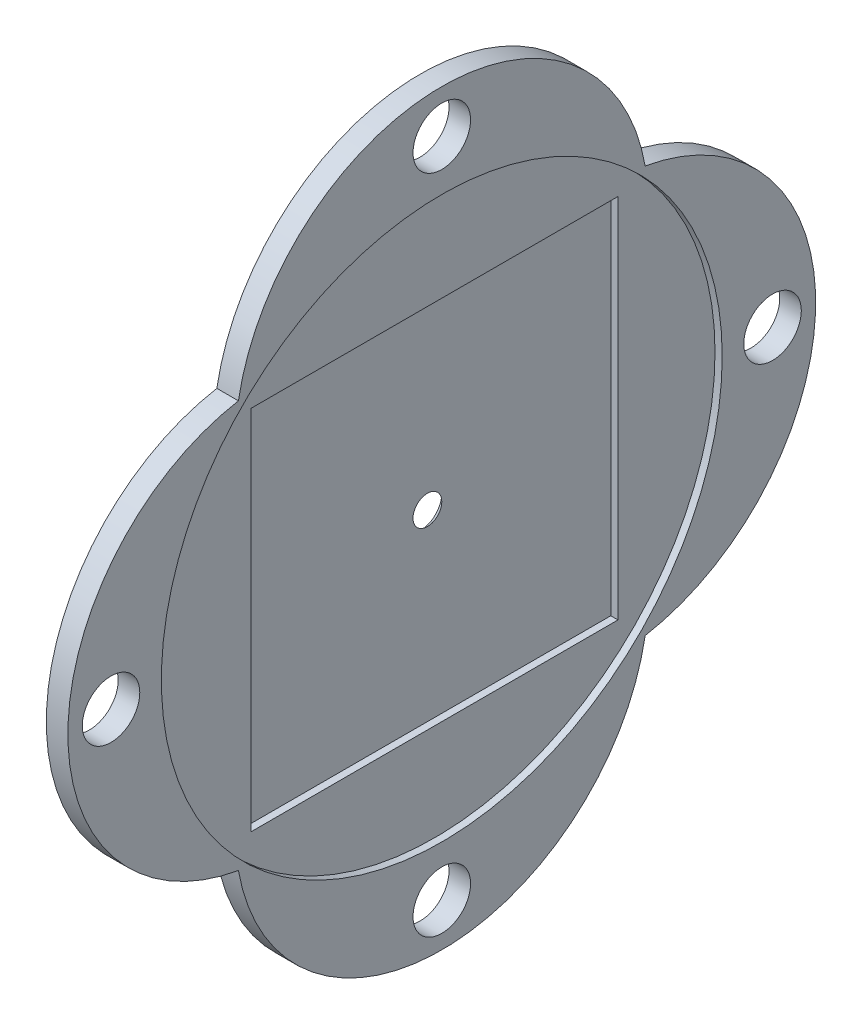
ISO-10303-21;
HEADER;
FILE_DESCRIPTION(('STEP AP214'),'2;1');
FILE_NAME('part.step','',(''),(''),'','','');
FILE_SCHEMA(('AUTOMOTIVE_DESIGN { 1 0 10303 214 1 1 1 1 }'));
ENDSEC;
DATA;
#1=APPLICATION_CONTEXT('core data for automotive mechanical design processes');
#2=APPLICATION_PROTOCOL_DEFINITION('international standard','automotive_design',2000,#1);
#3=PRODUCT_CONTEXT('',#1,'mechanical');
#4=PRODUCT('Part','Part','',(#3));
#5=PRODUCT_RELATED_PRODUCT_CATEGORY('part','',(#4));
#6=PRODUCT_DEFINITION_FORMATION('','',#4);
#7=PRODUCT_DEFINITION_CONTEXT('part definition',#1,'design');
#8=PRODUCT_DEFINITION('design','',#6,#7);
#9=PRODUCT_DEFINITION_SHAPE('','',#8);
#10=(LENGTH_UNIT() NAMED_UNIT(*) SI_UNIT(.MILLI.,.METRE.));
#11=(NAMED_UNIT(*) PLANE_ANGLE_UNIT() SI_UNIT($,.RADIAN.));
#12=(NAMED_UNIT(*) SI_UNIT($,.STERADIAN.) SOLID_ANGLE_UNIT());
#13=UNCERTAINTY_MEASURE_WITH_UNIT(LENGTH_MEASURE(1.E-05),#10,'distance_accuracy_value','');
#14=(GEOMETRIC_REPRESENTATION_CONTEXT(3) GLOBAL_UNCERTAINTY_ASSIGNED_CONTEXT((#13)) GLOBAL_UNIT_ASSIGNED_CONTEXT((#10,
#11,#12)) REPRESENTATION_CONTEXT('',''));
#15=CARTESIAN_POINT('',(0.,0.,0.));
#16=DIRECTION('',(0.,0.,1.));
#17=DIRECTION('',(1.,0.,0.));
#18=AXIS2_PLACEMENT_3D('',#15,#16,#17);
#19=CARTESIAN_POINT('',(0.75,-5.81892302108712,-5.81892302108705));
#20=DIRECTION('',(1.,0.,0.));
#21=DIRECTION('',(0.,0.,-1.));
#22=AXIS2_PLACEMENT_3D('',#19,#20,#21);
#23=PLANE('',#22);
#24=CARTESIAN_POINT('',(0.75,0.,0.));
#25=DIRECTION('',(1.,0.,0.));
#26=DIRECTION('',(0.,0.,-1.));
#27=AXIS2_PLACEMENT_3D('',#24,#25,#26);
#28=CIRCLE('',#27,19.5);
#29=CARTESIAN_POINT('',(0.75,0.,-19.5));
#30=VERTEX_POINT('',#29);
#31=EDGE_CURVE('E152',#30,#30,#28,.T.);
#32=ORIENTED_EDGE('',*,*,#31,.F.);
#33=EDGE_LOOP('',(#32));
#34=FACE_BOUND('',#33,.T.);
#35=CARTESIAN_POINT('',(0.75,-23.,0.));
#36=DIRECTION('',(1.,0.,0.));
#37=DIRECTION('',(0.,0.,-1.));
#38=AXIS2_PLACEMENT_3D('',#35,#36,#37);
#39=CIRCLE('',#38,2.);
#40=CARTESIAN_POINT('',(0.75,-23.,-2.));
#41=VERTEX_POINT('',#40);
#42=EDGE_CURVE('E168',#41,#41,#39,.T.);
#43=ORIENTED_EDGE('',*,*,#42,.F.);
#44=EDGE_LOOP('',(#43));
#45=FACE_BOUND('',#44,.T.);
#46=CARTESIAN_POINT('',(0.75,23.,0.));
#47=DIRECTION('',(1.,0.,0.));
#48=DIRECTION('',(0.,0.,-1.));
#49=AXIS2_PLACEMENT_3D('',#46,#47,#48);
#50=CIRCLE('',#49,2.);
#51=CARTESIAN_POINT('',(0.75,23.,-2.));
#52=VERTEX_POINT('',#51);
#53=EDGE_CURVE('E180',#52,#52,#50,.T.);
#54=ORIENTED_EDGE('',*,*,#53,.F.);
#55=EDGE_LOOP('',(#54));
#56=FACE_BOUND('',#55,.T.);
#57=CARTESIAN_POINT('',(0.75,-11.6378460421741,0.));
#58=DIRECTION('',(1.,0.,0.));
#59=DIRECTION('',(0.,0.,-1.));
#60=AXIS2_PLACEMENT_3D('',#57,#58,#59);
#61=CIRCLE('',#60,14.3621539578259);
#62=CARTESIAN_POINT('',(0.75,-14.1421356237309,14.142135623731));
#63=VERTEX_POINT('',#62);
#64=CARTESIAN_POINT('',(0.75,-14.142135623731,-14.142135623731));
#65=VERTEX_POINT('',#64);
#66=EDGE_CURVE('E186',#63,#65,#61,.T.);
#67=ORIENTED_EDGE('',*,*,#66,.T.);
#68=CARTESIAN_POINT('',(0.75,-1.21899966841741E-13,-11.6378460421741));
#69=DIRECTION('',(1.,0.,0.));
#70=DIRECTION('',(0.,0.,-1.));
#71=AXIS2_PLACEMENT_3D('',#68,#69,#70);
#72=CIRCLE('',#71,14.3621539578259);
#73=CARTESIAN_POINT('',(0.75,14.1421356237309,-14.1421356237311));
#74=VERTEX_POINT('',#73);
#75=EDGE_CURVE('E93',#65,#74,#72,.T.);
#76=ORIENTED_EDGE('',*,*,#75,.T.);
#77=CARTESIAN_POINT('',(0.75,11.6378460421741,0.));
#78=DIRECTION('',(1.,0.,0.));
#79=DIRECTION('',(0.,0.,-1.));
#80=AXIS2_PLACEMENT_3D('',#77,#78,#79);
#81=CIRCLE('',#80,14.3621539578259);
#82=CARTESIAN_POINT('',(0.75,14.142135623731,14.1421356237309));
#83=VERTEX_POINT('',#82);
#84=EDGE_CURVE('E189',#74,#83,#81,.T.);
#85=ORIENTED_EDGE('',*,*,#84,.T.);
#86=CARTESIAN_POINT('',(0.75,0.,11.6378460421741));
#87=DIRECTION('',(1.,0.,0.));
#88=DIRECTION('',(0.,0.,-1.));
#89=AXIS2_PLACEMENT_3D('',#86,#87,#88);
#90=CIRCLE('',#89,14.3621539578259);
#91=EDGE_CURVE('E64',#83,#63,#90,.T.);
#92=ORIENTED_EDGE('',*,*,#91,.T.);
#93=EDGE_LOOP('',(#67,#76,#85,#92));
#94=FACE_BOUND('',#93,.T.);
#95=CARTESIAN_POINT('',(0.75,0.,-23.));
#96=DIRECTION('',(1.,0.,0.));
#97=DIRECTION('',(0.,0.,-1.));
#98=AXIS2_PLACEMENT_3D('',#95,#96,#97);
#99=CIRCLE('',#98,2.);
#100=CARTESIAN_POINT('',(0.75,0.,-25.));
#101=VERTEX_POINT('',#100);
#102=EDGE_CURVE('E174',#101,#101,#99,.T.);
#103=ORIENTED_EDGE('',*,*,#102,.F.);
#104=EDGE_LOOP('',(#103));
#105=FACE_BOUND('',#104,.T.);
#106=CARTESIAN_POINT('',(0.75,0.,23.));
#107=DIRECTION('',(1.,0.,0.));
#108=DIRECTION('',(0.,0.,-1.));
#109=AXIS2_PLACEMENT_3D('',#106,#107,#108);
#110=CIRCLE('',#109,2.);
#111=CARTESIAN_POINT('',(0.75,0.,21.));
#112=VERTEX_POINT('',#111);
#113=EDGE_CURVE('E162',#112,#112,#110,.T.);
#114=ORIENTED_EDGE('',*,*,#113,.F.);
#115=EDGE_LOOP('',(#114));
#116=FACE_BOUND('',#115,.T.);
#117=ADVANCED_FACE('F39',(#34,#45,#56,#94,#105,#116),#23,.T.);
#118=CARTESIAN_POINT('',(-0.75,-5.81892302108712,-5.81892302108705));
#119=DIRECTION('',(1.,0.,0.));
#120=DIRECTION('',(0.,0.,-1.));
#121=AXIS2_PLACEMENT_3D('',#118,#119,#120);
#122=PLANE('',#121);
#123=CARTESIAN_POINT('',(-0.75,0.,0.));
#124=DIRECTION('',(1.,0.,0.));
#125=DIRECTION('',(0.,0.,-1.));
#126=AXIS2_PLACEMENT_3D('',#123,#124,#125);
#127=CIRCLE('',#126,1.50000000000002);
#128=CARTESIAN_POINT('',(-0.75,0.,-1.50000000000002));
#129=VERTEX_POINT('',#128);
#130=EDGE_CURVE('E48',#129,#129,#127,.T.);
#131=ORIENTED_EDGE('',*,*,#130,.T.);
#132=EDGE_LOOP('',(#131));
#133=FACE_BOUND('',#132,.T.);
#134=CARTESIAN_POINT('',(-0.75,-11.6378460421741,0.));
#135=DIRECTION('',(1.,0.,0.));
#136=DIRECTION('',(0.,0.,-1.));
#137=AXIS2_PLACEMENT_3D('',#134,#135,#136);
#138=CIRCLE('',#137,14.3621539578259);
#139=CARTESIAN_POINT('',(-0.75,-14.1421356237309,14.142135623731));
#140=VERTEX_POINT('',#139);
#141=CARTESIAN_POINT('',(-0.75,-14.142135623731,-14.142135623731));
#142=VERTEX_POINT('',#141);
#143=EDGE_CURVE('E183',#140,#142,#138,.T.);
#144=ORIENTED_EDGE('',*,*,#143,.F.);
#145=CARTESIAN_POINT('',(-0.75,0.,11.6378460421741));
#146=DIRECTION('',(1.,0.,0.));
#147=DIRECTION('',(0.,0.,-1.));
#148=AXIS2_PLACEMENT_3D('',#145,#146,#147);
#149=CIRCLE('',#148,14.3621539578259);
#150=CARTESIAN_POINT('',(-0.75,14.142135623731,14.1421356237309));
#151=VERTEX_POINT('',#150);
#152=EDGE_CURVE('E85',#151,#140,#149,.T.);
#153=ORIENTED_EDGE('',*,*,#152,.F.);
#154=CARTESIAN_POINT('',(-0.75,11.6378460421741,0.));
#155=DIRECTION('',(1.,0.,0.));
#156=DIRECTION('',(0.,0.,-1.));
#157=AXIS2_PLACEMENT_3D('',#154,#155,#156);
#158=CIRCLE('',#157,14.3621539578259);
#159=CARTESIAN_POINT('',(-0.75,14.1421356237309,-14.1421356237311));
#160=VERTEX_POINT('',#159);
#161=EDGE_CURVE('E197',#160,#151,#158,.T.);
#162=ORIENTED_EDGE('',*,*,#161,.F.);
#163=CARTESIAN_POINT('',(-0.75,-1.21899966841741E-13,-11.6378460421741));
#164=DIRECTION('',(1.,0.,0.));
#165=DIRECTION('',(0.,0.,-1.));
#166=AXIS2_PLACEMENT_3D('',#163,#164,#165);
#167=CIRCLE('',#166,14.3621539578259);
#168=EDGE_CURVE('E195',#142,#160,#167,.T.);
#169=ORIENTED_EDGE('',*,*,#168,.F.);
#170=EDGE_LOOP('',(#144,#153,#162,#169));
#171=FACE_BOUND('',#170,.T.);
#172=CARTESIAN_POINT('',(-0.75,23.,0.));
#173=DIRECTION('',(1.,0.,0.));
#174=DIRECTION('',(0.,0.,-1.));
#175=AXIS2_PLACEMENT_3D('',#172,#173,#174);
#176=CIRCLE('',#175,2.);
#177=CARTESIAN_POINT('',(-0.75,23.,-2.));
#178=VERTEX_POINT('',#177);
#179=EDGE_CURVE('E177',#178,#178,#176,.T.);
#180=ORIENTED_EDGE('',*,*,#179,.T.);
#181=EDGE_LOOP('',(#180));
#182=FACE_BOUND('',#181,.T.);
#183=CARTESIAN_POINT('',(-0.75,0.,-23.));
#184=DIRECTION('',(1.,0.,0.));
#185=DIRECTION('',(0.,0.,-1.));
#186=AXIS2_PLACEMENT_3D('',#183,#184,#185);
#187=CIRCLE('',#186,2.);
#188=CARTESIAN_POINT('',(-0.75,0.,-25.));
#189=VERTEX_POINT('',#188);
#190=EDGE_CURVE('E171',#189,#189,#187,.T.);
#191=ORIENTED_EDGE('',*,*,#190,.T.);
#192=EDGE_LOOP('',(#191));
#193=FACE_BOUND('',#192,.T.);
#194=CARTESIAN_POINT('',(-0.75,-23.,0.));
#195=DIRECTION('',(1.,0.,0.));
#196=DIRECTION('',(0.,0.,-1.));
#197=AXIS2_PLACEMENT_3D('',#194,#195,#196);
#198=CIRCLE('',#197,2.);
#199=CARTESIAN_POINT('',(-0.75,-23.,-2.));
#200=VERTEX_POINT('',#199);
#201=EDGE_CURVE('E165',#200,#200,#198,.T.);
#202=ORIENTED_EDGE('',*,*,#201,.T.);
#203=EDGE_LOOP('',(#202));
#204=FACE_BOUND('',#203,.T.);
#205=CARTESIAN_POINT('',(-0.75,0.,23.));
#206=DIRECTION('',(1.,0.,0.));
#207=DIRECTION('',(0.,0.,-1.));
#208=AXIS2_PLACEMENT_3D('',#205,#206,#207);
#209=CIRCLE('',#208,2.);
#210=CARTESIAN_POINT('',(-0.75,0.,21.));
#211=VERTEX_POINT('',#210);
#212=EDGE_CURVE('E159',#211,#211,#209,.T.);
#213=ORIENTED_EDGE('',*,*,#212,.T.);
#214=EDGE_LOOP('',(#213));
#215=FACE_BOUND('',#214,.T.);
#216=ADVANCED_FACE('F210',(#133,#171,#182,#193,#204,#215),#122,.F.);
#217=CARTESIAN_POINT('',(0.75,-11.6378460421741,0.));
#218=DIRECTION('',(-1.,0.,0.));
#219=DIRECTION('',(0.,0.,1.));
#220=AXIS2_PLACEMENT_3D('',#217,#218,#219);
#221=CYLINDRICAL_SURFACE('',#220,14.3621539578259);
#222=ORIENTED_EDGE('',*,*,#143,.T.);
#223=DIRECTION('',(-1.,0.,0.));
#224=VECTOR('',#223,1.);
#225=CARTESIAN_POINT('',(0.75,-14.142135623731,-14.142135623731));
#226=LINE('',#225,#224);
#227=EDGE_CURVE('E206',#65,#142,#226,.T.);
#228=ORIENTED_EDGE('',*,*,#227,.F.);
#229=ORIENTED_EDGE('',*,*,#66,.F.);
#230=DIRECTION('',(-1.,0.,0.));
#231=VECTOR('',#230,1.);
#232=CARTESIAN_POINT('',(0.75,-14.1421356237309,14.142135623731));
#233=LINE('',#232,#231);
#234=EDGE_CURVE('E192',#63,#140,#233,.T.);
#235=ORIENTED_EDGE('',*,*,#234,.T.);
#236=EDGE_LOOP('',(#222,#228,#229,#235));
#237=FACE_BOUND('',#236,.T.);
#238=ADVANCED_FACE('F227',(#237),#221,.T.);
#239=CARTESIAN_POINT('',(0.75,-1.21899966841741E-13,-11.6378460421741));
#240=DIRECTION('',(-1.,0.,0.));
#241=DIRECTION('',(0.,0.,1.));
#242=AXIS2_PLACEMENT_3D('',#239,#240,#241);
#243=CYLINDRICAL_SURFACE('',#242,14.3621539578259);
#244=ORIENTED_EDGE('',*,*,#168,.T.);
#245=DIRECTION('',(-1.,0.,0.));
#246=VECTOR('',#245,1.);
#247=CARTESIAN_POINT('',(0.75,14.1421356237309,-14.1421356237311));
#248=LINE('',#247,#246);
#249=EDGE_CURVE('E203',#74,#160,#248,.T.);
#250=ORIENTED_EDGE('',*,*,#249,.F.);
#251=ORIENTED_EDGE('',*,*,#75,.F.);
#252=ORIENTED_EDGE('',*,*,#227,.T.);
#253=EDGE_LOOP('',(#244,#250,#251,#252));
#254=FACE_BOUND('',#253,.T.);
#255=ADVANCED_FACE('F241',(#254),#243,.T.);
#256=CARTESIAN_POINT('',(0.75,11.6378460421741,0.));
#257=DIRECTION('',(-1.,0.,0.));
#258=DIRECTION('',(0.,0.,1.));
#259=AXIS2_PLACEMENT_3D('',#256,#257,#258);
#260=CYLINDRICAL_SURFACE('',#259,14.3621539578259);
#261=ORIENTED_EDGE('',*,*,#161,.T.);
#262=DIRECTION('',(-1.,0.,0.));
#263=VECTOR('',#262,1.);
#264=CARTESIAN_POINT('',(0.75,14.142135623731,14.1421356237309));
#265=LINE('',#264,#263);
#266=EDGE_CURVE('E201',#83,#151,#265,.T.);
#267=ORIENTED_EDGE('',*,*,#266,.F.);
#268=ORIENTED_EDGE('',*,*,#84,.F.);
#269=ORIENTED_EDGE('',*,*,#249,.T.);
#270=EDGE_LOOP('',(#261,#267,#268,#269));
#271=FACE_BOUND('',#270,.T.);
#272=ADVANCED_FACE('F238',(#271),#260,.T.);
#273=CARTESIAN_POINT('',(0.75,0.,11.6378460421741));
#274=DIRECTION('',(-1.,0.,0.));
#275=DIRECTION('',(0.,0.,1.));
#276=AXIS2_PLACEMENT_3D('',#273,#274,#275);
#277=CYLINDRICAL_SURFACE('',#276,14.3621539578259);
#278=ORIENTED_EDGE('',*,*,#152,.T.);
#279=ORIENTED_EDGE('',*,*,#234,.F.);
#280=ORIENTED_EDGE('',*,*,#91,.F.);
#281=ORIENTED_EDGE('',*,*,#266,.T.);
#282=EDGE_LOOP('',(#278,#279,#280,#281));
#283=FACE_BOUND('',#282,.T.);
#284=ADVANCED_FACE('F235',(#283),#277,.T.);
#285=CARTESIAN_POINT('',(0.75,23.,0.));
#286=DIRECTION('',(-1.,0.,0.));
#287=DIRECTION('',(0.,0.,1.));
#288=AXIS2_PLACEMENT_3D('',#285,#286,#287);
#289=CYLINDRICAL_SURFACE('',#288,2.);
#290=ORIENTED_EDGE('',*,*,#53,.T.);
#291=EDGE_LOOP('',(#290));
#292=FACE_BOUND('',#291,.T.);
#293=ORIENTED_EDGE('',*,*,#179,.F.);
#294=EDGE_LOOP('',(#293));
#295=FACE_BOUND('',#294,.T.);
#296=ADVANCED_FACE('F232',(#292,#295),#289,.F.);
#297=CARTESIAN_POINT('',(0.75,0.,-23.));
#298=DIRECTION('',(-1.,0.,0.));
#299=DIRECTION('',(0.,0.,1.));
#300=AXIS2_PLACEMENT_3D('',#297,#298,#299);
#301=CYLINDRICAL_SURFACE('',#300,2.);
#302=ORIENTED_EDGE('',*,*,#102,.T.);
#303=EDGE_LOOP('',(#302));
#304=FACE_BOUND('',#303,.T.);
#305=ORIENTED_EDGE('',*,*,#190,.F.);
#306=EDGE_LOOP('',(#305));
#307=FACE_BOUND('',#306,.T.);
#308=ADVANCED_FACE('F275',(#304,#307),#301,.F.);
#309=CARTESIAN_POINT('',(0.75,-23.,0.));
#310=DIRECTION('',(-1.,0.,0.));
#311=DIRECTION('',(0.,0.,1.));
#312=AXIS2_PLACEMENT_3D('',#309,#310,#311);
#313=CYLINDRICAL_SURFACE('',#312,2.);
#314=ORIENTED_EDGE('',*,*,#42,.T.);
#315=EDGE_LOOP('',(#314));
#316=FACE_BOUND('',#315,.T.);
#317=ORIENTED_EDGE('',*,*,#201,.F.);
#318=EDGE_LOOP('',(#317));
#319=FACE_BOUND('',#318,.T.);
#320=ADVANCED_FACE('F264',(#316,#319),#313,.F.);
#321=CARTESIAN_POINT('',(0.75,0.,23.));
#322=DIRECTION('',(-1.,0.,0.));
#323=DIRECTION('',(0.,0.,1.));
#324=AXIS2_PLACEMENT_3D('',#321,#322,#323);
#325=CYLINDRICAL_SURFACE('',#324,2.);
#326=ORIENTED_EDGE('',*,*,#113,.T.);
#327=EDGE_LOOP('',(#326));
#328=FACE_BOUND('',#327,.T.);
#329=ORIENTED_EDGE('',*,*,#212,.F.);
#330=EDGE_LOOP('',(#329));
#331=FACE_BOUND('',#330,.T.);
#332=ADVANCED_FACE('F260',(#328,#331),#325,.F.);
#333=CARTESIAN_POINT('',(0.25,0.,0.));
#334=DIRECTION('',(1.,0.,0.));
#335=DIRECTION('',(0.,0.,-1.));
#336=AXIS2_PLACEMENT_3D('',#333,#334,#335);
#337=CYLINDRICAL_SURFACE('',#336,19.5);
#338=CARTESIAN_POINT('',(0.25,0.,0.));
#339=DIRECTION('',(1.,0.,0.));
#340=DIRECTION('',(0.,0.,-1.));
#341=AXIS2_PLACEMENT_3D('',#338,#339,#340);
#342=CIRCLE('',#341,19.5);
#343=CARTESIAN_POINT('',(0.25,0.,-19.5));
#344=VERTEX_POINT('',#343);
#345=EDGE_CURVE('E156',#344,#344,#342,.T.);
#346=ORIENTED_EDGE('',*,*,#345,.F.);
#347=EDGE_LOOP('',(#346));
#348=FACE_BOUND('',#347,.T.);
#349=ORIENTED_EDGE('',*,*,#31,.T.);
#350=EDGE_LOOP('',(#349));
#351=FACE_BOUND('',#350,.T.);
#352=ADVANCED_FACE('F263',(#348,#351),#337,.F.);
#353=CARTESIAN_POINT('',(0.25,0.,0.));
#354=DIRECTION('',(1.,0.,0.));
#355=DIRECTION('',(0.,0.,-1.));
#356=AXIS2_PLACEMENT_3D('',#353,#354,#355);
#357=PLANE('',#356);
#358=DIRECTION('',(0.,-1.,0.));
#359=VECTOR('',#358,1.);
#360=CARTESIAN_POINT('',(0.25,12.75,12.75));
#361=LINE('',#360,#359);
#362=CARTESIAN_POINT('',(0.25,12.75,12.75));
#363=VERTEX_POINT('',#362);
#364=CARTESIAN_POINT('',(0.25,-12.75,12.75));
#365=VERTEX_POINT('',#364);
#366=EDGE_CURVE('E122',#363,#365,#361,.T.);
#367=ORIENTED_EDGE('',*,*,#366,.F.);
#368=DIRECTION('',(0.,0.,1.));
#369=VECTOR('',#368,1.);
#370=CARTESIAN_POINT('',(0.25,12.75,12.75));
#371=LINE('',#370,#369);
#372=CARTESIAN_POINT('',(0.25,12.75,-12.75));
#373=VERTEX_POINT('',#372);
#374=EDGE_CURVE('E139',#373,#363,#371,.T.);
#375=ORIENTED_EDGE('',*,*,#374,.F.);
#376=DIRECTION('',(0.,1.,0.));
#377=VECTOR('',#376,1.);
#378=CARTESIAN_POINT('',(0.25,12.75,-12.75));
#379=LINE('',#378,#377);
#380=CARTESIAN_POINT('',(0.25,-12.75,-12.75));
#381=VERTEX_POINT('',#380);
#382=EDGE_CURVE('E55',#381,#373,#379,.T.);
#383=ORIENTED_EDGE('',*,*,#382,.F.);
#384=DIRECTION('',(0.,0.,-1.));
#385=VECTOR('',#384,1.);
#386=CARTESIAN_POINT('',(0.25,-12.75,12.75));
#387=LINE('',#386,#385);
#388=EDGE_CURVE('E147',#365,#381,#387,.T.);
#389=ORIENTED_EDGE('',*,*,#388,.F.);
#390=EDGE_LOOP('',(#367,#375,#383,#389));
#391=FACE_BOUND('',#390,.T.);
#392=ORIENTED_EDGE('',*,*,#345,.T.);
#393=EDGE_LOOP('',(#392));
#394=FACE_BOUND('',#393,.T.);
#395=ADVANCED_FACE('F272',(#391,#394),#357,.T.);
#396=CARTESIAN_POINT('',(-0.25,12.75,12.75));
#397=DIRECTION('',(0.,0.,1.));
#398=DIRECTION('',(1.,0.,0.));
#399=AXIS2_PLACEMENT_3D('',#396,#397,#398);
#400=PLANE('',#399);
#401=ORIENTED_EDGE('',*,*,#366,.T.);
#402=DIRECTION('',(1.,0.,0.));
#403=VECTOR('',#402,1.);
#404=CARTESIAN_POINT('',(-0.25,-12.75,12.75));
#405=LINE('',#404,#403);
#406=CARTESIAN_POINT('',(-0.25,-12.75,12.75));
#407=VERTEX_POINT('',#406);
#408=EDGE_CURVE('E115',#407,#365,#405,.T.);
#409=ORIENTED_EDGE('',*,*,#408,.F.);
#410=DIRECTION('',(0.,-1.,0.));
#411=VECTOR('',#410,1.);
#412=CARTESIAN_POINT('',(-0.25,12.75,12.75));
#413=LINE('',#412,#411);
#414=CARTESIAN_POINT('',(-0.25,12.75,12.75));
#415=VERTEX_POINT('',#414);
#416=EDGE_CURVE('E119',#415,#407,#413,.T.);
#417=ORIENTED_EDGE('',*,*,#416,.F.);
#418=DIRECTION('',(1.,0.,0.));
#419=VECTOR('',#418,1.);
#420=CARTESIAN_POINT('',(-0.25,12.75,12.75));
#421=LINE('',#420,#419);
#422=EDGE_CURVE('E150',#415,#363,#421,.T.);
#423=ORIENTED_EDGE('',*,*,#422,.T.);
#424=EDGE_LOOP('',(#401,#409,#417,#423));
#425=FACE_BOUND('',#424,.T.);
#426=ADVANCED_FACE('F117',(#425),#400,.F.);
#427=CARTESIAN_POINT('',(-0.25,12.75,12.75));
#428=DIRECTION('',(0.,1.,0.));
#429=DIRECTION('',(0.,0.,1.));
#430=AXIS2_PLACEMENT_3D('',#427,#428,#429);
#431=PLANE('',#430);
#432=ORIENTED_EDGE('',*,*,#374,.T.);
#433=ORIENTED_EDGE('',*,*,#422,.F.);
#434=DIRECTION('',(0.,0.,1.));
#435=VECTOR('',#434,1.);
#436=CARTESIAN_POINT('',(-0.25,12.75,12.75));
#437=LINE('',#436,#435);
#438=CARTESIAN_POINT('',(-0.25,12.75,-12.75));
#439=VERTEX_POINT('',#438);
#440=EDGE_CURVE('E127',#439,#415,#437,.T.);
#441=ORIENTED_EDGE('',*,*,#440,.F.);
#442=DIRECTION('',(1.,0.,0.));
#443=VECTOR('',#442,1.);
#444=CARTESIAN_POINT('',(-0.25,12.75,-12.75));
#445=LINE('',#444,#443);
#446=EDGE_CURVE('E153',#439,#373,#445,.T.);
#447=ORIENTED_EDGE('',*,*,#446,.T.);
#448=EDGE_LOOP('',(#432,#433,#441,#447));
#449=FACE_BOUND('',#448,.T.);
#450=ADVANCED_FACE('F359',(#449),#431,.F.);
#451=CARTESIAN_POINT('',(-0.25,12.75,-12.75));
#452=DIRECTION('',(0.,0.,-1.));
#453=DIRECTION('',(-1.,0.,0.));
#454=AXIS2_PLACEMENT_3D('',#451,#452,#453);
#455=PLANE('',#454);
#456=ORIENTED_EDGE('',*,*,#382,.T.);
#457=ORIENTED_EDGE('',*,*,#446,.F.);
#458=DIRECTION('',(0.,1.,0.));
#459=VECTOR('',#458,1.);
#460=CARTESIAN_POINT('',(-0.25,12.75,-12.75));
#461=LINE('',#460,#459);
#462=CARTESIAN_POINT('',(-0.25,-12.75,-12.75));
#463=VERTEX_POINT('',#462);
#464=EDGE_CURVE('E135',#463,#439,#461,.T.);
#465=ORIENTED_EDGE('',*,*,#464,.F.);
#466=DIRECTION('',(1.,0.,0.));
#467=VECTOR('',#466,1.);
#468=CARTESIAN_POINT('',(-0.25,-12.75,-12.75));
#469=LINE('',#468,#467);
#470=EDGE_CURVE('E126',#463,#381,#469,.T.);
#471=ORIENTED_EDGE('',*,*,#470,.T.);
#472=EDGE_LOOP('',(#456,#457,#465,#471));
#473=FACE_BOUND('',#472,.T.);
#474=ADVANCED_FACE('F369',(#473),#455,.F.);
#475=CARTESIAN_POINT('',(-0.25,-12.75,12.75));
#476=DIRECTION('',(0.,-1.,0.));
#477=DIRECTION('',(0.,0.,-1.));
#478=AXIS2_PLACEMENT_3D('',#475,#476,#477);
#479=PLANE('',#478);
#480=ORIENTED_EDGE('',*,*,#388,.T.);
#481=ORIENTED_EDGE('',*,*,#470,.F.);
#482=DIRECTION('',(0.,0.,-1.));
#483=VECTOR('',#482,1.);
#484=CARTESIAN_POINT('',(-0.25,-12.75,12.75));
#485=LINE('',#484,#483);
#486=EDGE_CURVE('E130',#407,#463,#485,.T.);
#487=ORIENTED_EDGE('',*,*,#486,.F.);
#488=ORIENTED_EDGE('',*,*,#408,.T.);
#489=EDGE_LOOP('',(#480,#481,#487,#488));
#490=FACE_BOUND('',#489,.T.);
#491=ADVANCED_FACE('F131',(#490),#479,.F.);
#492=CARTESIAN_POINT('',(-0.25,0.,0.));
#493=DIRECTION('',(1.,0.,0.));
#494=DIRECTION('',(0.,0.,-1.));
#495=AXIS2_PLACEMENT_3D('',#492,#493,#494);
#496=PLANE('',#495);
#497=CARTESIAN_POINT('',(-0.25,0.,0.));
#498=DIRECTION('',(1.,0.,0.));
#499=DIRECTION('',(0.,0.,-1.));
#500=AXIS2_PLACEMENT_3D('',#497,#498,#499);
#501=CIRCLE('',#500,1.00000000000001);
#502=CARTESIAN_POINT('',(-0.25,0.,-1.00000000000001));
#503=VERTEX_POINT('',#502);
#504=EDGE_CURVE('E11',#503,#503,#501,.F.);
#505=ORIENTED_EDGE('',*,*,#504,.T.);
#506=EDGE_LOOP('',(#505));
#507=FACE_BOUND('',#506,.T.);
#508=ORIENTED_EDGE('',*,*,#416,.T.);
#509=ORIENTED_EDGE('',*,*,#486,.T.);
#510=ORIENTED_EDGE('',*,*,#464,.T.);
#511=ORIENTED_EDGE('',*,*,#440,.T.);
#512=EDGE_LOOP('',(#508,#509,#510,#511));
#513=FACE_BOUND('',#512,.T.);
#514=ADVANCED_FACE('F137',(#507,#513),#496,.T.);
#515=CARTESIAN_POINT('',(-0.75,0.,0.));
#516=DIRECTION('',(-1.,0.,0.));
#517=DIRECTION('',(0.,0.,1.));
#518=AXIS2_PLACEMENT_3D('',#515,#516,#517);
#519=CONICAL_SURFACE('',#518,1.50000000000002,0.785398163397454);
#520=ORIENTED_EDGE('',*,*,#504,.F.);
#521=EDGE_LOOP('',(#520));
#522=FACE_BOUND('',#521,.T.);
#523=ORIENTED_EDGE('',*,*,#130,.F.);
#524=EDGE_LOOP('',(#523));
#525=FACE_BOUND('',#524,.T.);
#526=ADVANCED_FACE('F42',(#522,#525),#519,.F.);
#527=CLOSED_SHELL('',(#117,#216,#238,#255,#272,#284,#296,#308,#320,#332,#352,#395,#426,#450,
#474,#491,#514,#526));
#528=MANIFOLD_SOLID_BREP('B2',#527);
#529=ADVANCED_BREP_SHAPE_REPRESENTATION('',(#18,#528),#14);
#530=SHAPE_DEFINITION_REPRESENTATION(#9,#529);
ENDSEC;
END-ISO-10303-21;
